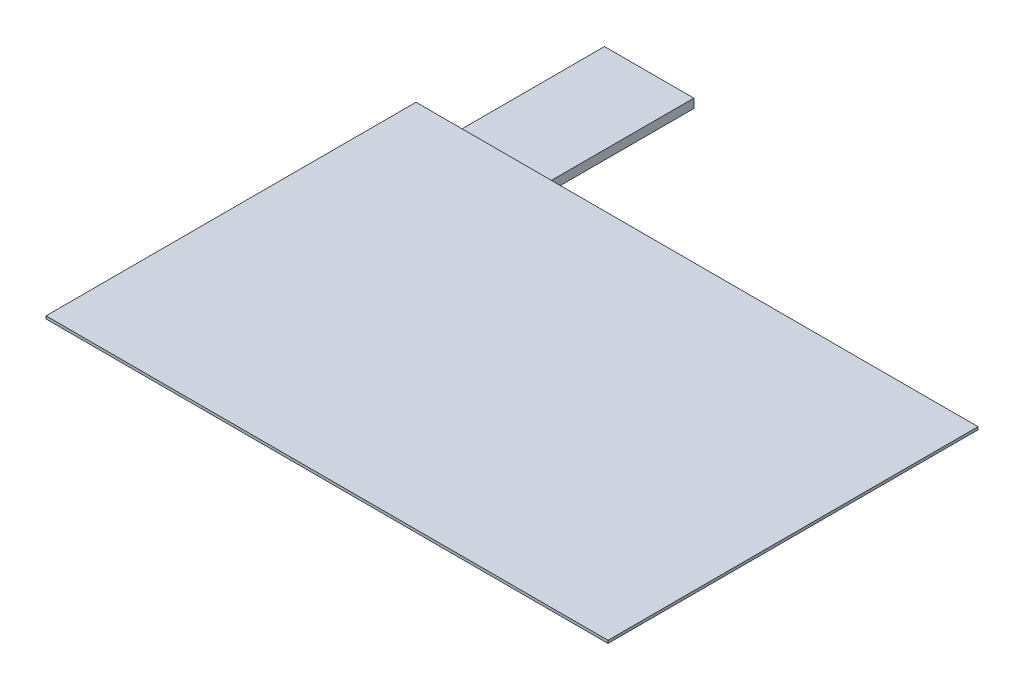
ISO-10303-21;
HEADER;
FILE_DESCRIPTION(('STEP AP214'),'2;1');
FILE_NAME('part.step','',(''),(''),'','','');
FILE_SCHEMA(('AUTOMOTIVE_DESIGN { 1 0 10303 214 1 1 1 1 }'));
ENDSEC;
DATA;
#1=APPLICATION_CONTEXT('core data for automotive mechanical design processes');
#2=APPLICATION_PROTOCOL_DEFINITION('international standard','automotive_design',2000,#1);
#3=PRODUCT_CONTEXT('',#1,'mechanical');
#4=PRODUCT('Part','Part','',(#3));
#5=PRODUCT_RELATED_PRODUCT_CATEGORY('part','',(#4));
#6=PRODUCT_DEFINITION_FORMATION('','',#4);
#7=PRODUCT_DEFINITION_CONTEXT('part definition',#1,'design');
#8=PRODUCT_DEFINITION('design','',#6,#7);
#9=PRODUCT_DEFINITION_SHAPE('','',#8);
#10=(LENGTH_UNIT() NAMED_UNIT(*) SI_UNIT(.MILLI.,.METRE.));
#11=(NAMED_UNIT(*) PLANE_ANGLE_UNIT() SI_UNIT($,.RADIAN.));
#12=(NAMED_UNIT(*) SI_UNIT($,.STERADIAN.) SOLID_ANGLE_UNIT());
#13=UNCERTAINTY_MEASURE_WITH_UNIT(LENGTH_MEASURE(1.E-05),#10,'distance_accuracy_value','');
#14=(GEOMETRIC_REPRESENTATION_CONTEXT(3) GLOBAL_UNCERTAINTY_ASSIGNED_CONTEXT((#13)) GLOBAL_UNIT_ASSIGNED_CONTEXT((#10,
#11,#12)) REPRESENTATION_CONTEXT('',''));
#15=CARTESIAN_POINT('',(0.,0.,0.));
#16=DIRECTION('',(0.,0.,1.));
#17=DIRECTION('',(1.,0.,0.));
#18=AXIS2_PLACEMENT_3D('',#15,#16,#17);
#19=CARTESIAN_POINT('',(-67.46875,91.4422048345292,-68.2625));
#20=DIRECTION('',(1.,0.,0.));
#21=DIRECTION('',(0.,0.,-1.));
#22=AXIS2_PLACEMENT_3D('',#19,#20,#21);
#23=PLANE('',#22);
#24=DIRECTION('',(0.,0.,-1.));
#25=VECTOR('',#24,1.);
#26=CARTESIAN_POINT('',(-67.46875,0.,-68.2625));
#27=LINE('',#26,#25);
#28=CARTESIAN_POINT('',(-67.46875,0.,-68.2625));
#29=VERTEX_POINT('',#28);
#30=CARTESIAN_POINT('',(-67.46875,0.,-150.1775));
#31=VERTEX_POINT('',#30);
#32=EDGE_CURVE('E51',#29,#31,#27,.T.);
#33=ORIENTED_EDGE('',*,*,#32,.F.);
#34=DIRECTION('',(0.,-1.,0.));
#35=VECTOR('',#34,1.);
#36=CARTESIAN_POINT('',(-67.46875,91.4422048345292,-68.2625));
#37=LINE('',#36,#35);
#38=CARTESIAN_POINT('',(-67.46875,-4.0894,-68.2625));
#39=VERTEX_POINT('',#38);
#40=EDGE_CURVE('E79',#29,#39,#37,.T.);
#41=ORIENTED_EDGE('',*,*,#40,.T.);
#42=DIRECTION('',(0.,0.,1.));
#43=VECTOR('',#42,1.);
#44=CARTESIAN_POINT('',(-67.46875,-4.0894,-68.2625));
#45=LINE('',#44,#43);
#46=CARTESIAN_POINT('',(-67.46875,-4.0894,-150.1775));
#47=VERTEX_POINT('',#46);
#48=EDGE_CURVE('E83',#47,#39,#45,.T.);
#49=ORIENTED_EDGE('',*,*,#48,.F.);
#50=DIRECTION('',(0.,-1.,0.));
#51=VECTOR('',#50,1.);
#52=CARTESIAN_POINT('',(-67.46875,91.4422048345292,-150.1775));
#53=LINE('',#52,#51);
#54=EDGE_CURVE('E106',#31,#47,#53,.T.);
#55=ORIENTED_EDGE('',*,*,#54,.F.);
#56=EDGE_LOOP('',(#33,#41,#49,#55));
#57=FACE_BOUND('',#56,.T.);
#58=ADVANCED_FACE('F43',(#57),#23,.T.);
#59=CARTESIAN_POINT('',(-108.10875,91.4422048345292,-150.1775));
#60=DIRECTION('',(0.,0.,-1.));
#61=DIRECTION('',(-1.,0.,0.));
#62=AXIS2_PLACEMENT_3D('',#59,#60,#61);
#63=PLANE('',#62);
#64=DIRECTION('',(-1.,0.,0.));
#65=VECTOR('',#64,1.);
#66=CARTESIAN_POINT('',(-108.10875,0.,-150.1775));
#67=LINE('',#66,#65);
#68=CARTESIAN_POINT('',(-108.10875,0.,-150.1775));
#69=VERTEX_POINT('',#68);
#70=EDGE_CURVE('E57',#31,#69,#67,.T.);
#71=ORIENTED_EDGE('',*,*,#70,.F.);
#72=ORIENTED_EDGE('',*,*,#54,.T.);
#73=DIRECTION('',(1.,0.,0.));
#74=VECTOR('',#73,1.);
#75=CARTESIAN_POINT('',(-108.10875,-4.0894,-150.1775));
#76=LINE('',#75,#74);
#77=CARTESIAN_POINT('',(-108.10875,-4.0894,-150.1775));
#78=VERTEX_POINT('',#77);
#79=EDGE_CURVE('E88',#78,#47,#76,.T.);
#80=ORIENTED_EDGE('',*,*,#79,.F.);
#81=DIRECTION('',(0.,-1.,0.));
#82=VECTOR('',#81,1.);
#83=CARTESIAN_POINT('',(-108.10875,91.4422048345292,-150.1775));
#84=LINE('',#83,#82);
#85=EDGE_CURVE('E109',#69,#78,#84,.T.);
#86=ORIENTED_EDGE('',*,*,#85,.F.);
#87=EDGE_LOOP('',(#71,#72,#80,#86));
#88=FACE_BOUND('',#87,.T.);
#89=ADVANCED_FACE('F115',(#88),#63,.T.);
#90=CARTESIAN_POINT('',(-108.10875,91.4422048345292,-68.2625));
#91=DIRECTION('',(-1.,0.,0.));
#92=DIRECTION('',(0.,0.,1.));
#93=AXIS2_PLACEMENT_3D('',#90,#91,#92);
#94=PLANE('',#93);
#95=DIRECTION('',(0.,0.,1.));
#96=VECTOR('',#95,1.);
#97=CARTESIAN_POINT('',(-108.10875,0.,-68.2625));
#98=LINE('',#97,#96);
#99=CARTESIAN_POINT('',(-108.10875,0.,-68.2625));
#100=VERTEX_POINT('',#99);
#101=EDGE_CURVE('E108',#69,#100,#98,.T.);
#102=ORIENTED_EDGE('',*,*,#101,.F.);
#103=ORIENTED_EDGE('',*,*,#85,.T.);
#104=DIRECTION('',(0.,0.,-1.));
#105=VECTOR('',#104,1.);
#106=CARTESIAN_POINT('',(-108.10875,-4.0894,-68.2625));
#107=LINE('',#106,#105);
#108=CARTESIAN_POINT('',(-108.10875,-4.0894,-68.2625));
#109=VERTEX_POINT('',#108);
#110=EDGE_CURVE('E96',#109,#78,#107,.T.);
#111=ORIENTED_EDGE('',*,*,#110,.F.);
#112=DIRECTION('',(0.,-1.,0.));
#113=VECTOR('',#112,1.);
#114=CARTESIAN_POINT('',(-108.10875,91.4422048345292,-68.2625));
#115=LINE('',#114,#113);
#116=EDGE_CURVE('E87',#100,#109,#115,.T.);
#117=ORIENTED_EDGE('',*,*,#116,.F.);
#118=EDGE_LOOP('',(#102,#103,#111,#117));
#119=FACE_BOUND('',#118,.T.);
#120=ADVANCED_FACE('F113',(#119),#94,.T.);
#121=CARTESIAN_POINT('',(-108.10875,91.4422048345292,-68.2625));
#122=DIRECTION('',(0.,0.,1.));
#123=DIRECTION('',(1.,0.,0.));
#124=AXIS2_PLACEMENT_3D('',#121,#122,#123);
#125=PLANE('',#124);
#126=DIRECTION('',(1.,0.,0.));
#127=VECTOR('',#126,1.);
#128=CARTESIAN_POINT('',(-108.10875,0.,-68.2625));
#129=LINE('',#128,#127);
#130=EDGE_CURVE('E12',#100,#29,#129,.T.);
#131=ORIENTED_EDGE('',*,*,#130,.F.);
#132=ORIENTED_EDGE('',*,*,#116,.T.);
#133=DIRECTION('',(-1.,0.,0.));
#134=VECTOR('',#133,1.);
#135=CARTESIAN_POINT('',(-108.10875,-4.0894,-68.2625));
#136=LINE('',#135,#134);
#137=EDGE_CURVE('E90',#39,#109,#136,.T.);
#138=ORIENTED_EDGE('',*,*,#137,.F.);
#139=ORIENTED_EDGE('',*,*,#40,.F.);
#140=EDGE_LOOP('',(#131,#132,#138,#139));
#141=FACE_BOUND('',#140,.T.);
#142=ADVANCED_FACE('F91',(#141),#125,.T.);
#143=CARTESIAN_POINT('',(0.,-4.0894,0.));
#144=DIRECTION('',(0.,-1.,0.));
#145=DIRECTION('',(0.,0.,-1.));
#146=AXIS2_PLACEMENT_3D('',#143,#144,#145);
#147=PLANE('',#146);
#148=ORIENTED_EDGE('',*,*,#48,.T.);
#149=ORIENTED_EDGE('',*,*,#137,.T.);
#150=ORIENTED_EDGE('',*,*,#110,.T.);
#151=ORIENTED_EDGE('',*,*,#79,.T.);
#152=EDGE_LOOP('',(#148,#149,#150,#151));
#153=FACE_BOUND('',#152,.T.);
#154=ADVANCED_FACE('F98',(#153),#147,.T.);
#155=CARTESIAN_POINT('',(0.,0.,0.));
#156=DIRECTION('',(0.,-1.,0.));
#157=DIRECTION('',(0.,0.,-1.));
#158=AXIS2_PLACEMENT_3D('',#155,#156,#157);
#159=PLANE('',#158);
#160=ORIENTED_EDGE('',*,*,#32,.T.);
#161=ORIENTED_EDGE('',*,*,#70,.T.);
#162=ORIENTED_EDGE('',*,*,#101,.T.);
#163=ORIENTED_EDGE('',*,*,#130,.T.);
#164=EDGE_LOOP('',(#160,#161,#162,#163));
#165=FACE_BOUND('',#164,.T.);
#166=ADVANCED_FACE('F117',(#165),#159,.F.);
#167=CLOSED_SHELL('',(#58,#89,#120,#142,#154,#166));
#168=MANIFOLD_SOLID_BREP('B2',#167);
#169=CARTESIAN_POINT('',(127.79375,1.2446,84.1375));
#170=DIRECTION('',(-1.,0.,0.));
#171=DIRECTION('',(0.,0.,1.));
#172=AXIS2_PLACEMENT_3D('',#169,#170,#171);
#173=PLANE('',#172);
#174=DIRECTION('',(0.,0.,-1.));
#175=VECTOR('',#174,1.);
#176=CARTESIAN_POINT('',(127.79375,0.,84.1375));
#177=LINE('',#176,#175);
#178=CARTESIAN_POINT('',(127.79375,0.,84.1375));
#179=VERTEX_POINT('',#178);
#180=CARTESIAN_POINT('',(127.79375,0.,-84.1375));
#181=VERTEX_POINT('',#180);
#182=EDGE_CURVE('E250',#179,#181,#177,.T.);
#183=ORIENTED_EDGE('',*,*,#182,.T.);
#184=DIRECTION('',(0.,-1.,0.));
#185=VECTOR('',#184,1.);
#186=CARTESIAN_POINT('',(127.79375,1.2446,-84.1375));
#187=LINE('',#186,#185);
#188=CARTESIAN_POINT('',(127.79375,1.2446,-84.1375));
#189=VERTEX_POINT('',#188);
#190=EDGE_CURVE('E41',#189,#181,#187,.T.);
#191=ORIENTED_EDGE('',*,*,#190,.F.);
#192=DIRECTION('',(0.,0.,-1.));
#193=VECTOR('',#192,1.);
#194=CARTESIAN_POINT('',(127.79375,1.2446,84.1375));
#195=LINE('',#194,#193);
#196=CARTESIAN_POINT('',(127.79375,1.2446,84.1375));
#197=VERTEX_POINT('',#196);
#198=EDGE_CURVE('E259',#197,#189,#195,.T.);
#199=ORIENTED_EDGE('',*,*,#198,.F.);
#200=DIRECTION('',(0.,-1.,0.));
#201=VECTOR('',#200,1.);
#202=CARTESIAN_POINT('',(127.79375,1.2446,84.1375));
#203=LINE('',#202,#201);
#204=EDGE_CURVE('E268',#197,#179,#203,.T.);
#205=ORIENTED_EDGE('',*,*,#204,.T.);
#206=EDGE_LOOP('',(#183,#191,#199,#205));
#207=FACE_BOUND('',#206,.T.);
#208=ADVANCED_FACE('F166',(#207),#173,.F.);
#209=CARTESIAN_POINT('',(-127.79375,1.2446,-84.1375));
#210=DIRECTION('',(0.,0.,1.));
#211=DIRECTION('',(1.,0.,0.));
#212=AXIS2_PLACEMENT_3D('',#209,#210,#211);
#213=PLANE('',#212);
#214=DIRECTION('',(-1.,0.,0.));
#215=VECTOR('',#214,1.);
#216=CARTESIAN_POINT('',(-127.79375,0.,-84.1375));
#217=LINE('',#216,#215);
#218=CARTESIAN_POINT('',(-127.79375,0.,-84.1375));
#219=VERTEX_POINT('',#218);
#220=EDGE_CURVE('E253',#181,#219,#217,.T.);
#221=ORIENTED_EDGE('',*,*,#220,.T.);
#222=DIRECTION('',(0.,-1.,0.));
#223=VECTOR('',#222,1.);
#224=CARTESIAN_POINT('',(-127.79375,1.2446,-84.1375));
#225=LINE('',#224,#223);
#226=CARTESIAN_POINT('',(-127.79375,1.2446,-84.1375));
#227=VERTEX_POINT('',#226);
#228=EDGE_CURVE('E173',#227,#219,#225,.T.);
#229=ORIENTED_EDGE('',*,*,#228,.F.);
#230=DIRECTION('',(-1.,0.,0.));
#231=VECTOR('',#230,1.);
#232=CARTESIAN_POINT('',(-127.79375,1.2446,-84.1375));
#233=LINE('',#232,#231);
#234=EDGE_CURVE('E262',#189,#227,#233,.T.);
#235=ORIENTED_EDGE('',*,*,#234,.F.);
#236=ORIENTED_EDGE('',*,*,#190,.T.);
#237=EDGE_LOOP('',(#221,#229,#235,#236));
#238=FACE_BOUND('',#237,.T.);
#239=ADVANCED_FACE('F299',(#238),#213,.F.);
#240=CARTESIAN_POINT('',(-127.79375,1.2446,84.1375));
#241=DIRECTION('',(1.,0.,0.));
#242=DIRECTION('',(0.,0.,-1.));
#243=AXIS2_PLACEMENT_3D('',#240,#241,#242);
#244=PLANE('',#243);
#245=DIRECTION('',(0.,0.,1.));
#246=VECTOR('',#245,1.);
#247=CARTESIAN_POINT('',(-127.79375,0.,84.1375));
#248=LINE('',#247,#246);
#249=CARTESIAN_POINT('',(-127.79375,0.,84.1375));
#250=VERTEX_POINT('',#249);
#251=EDGE_CURVE('E271',#219,#250,#248,.T.);
#252=ORIENTED_EDGE('',*,*,#251,.T.);
#253=DIRECTION('',(0.,-1.,0.));
#254=VECTOR('',#253,1.);
#255=CARTESIAN_POINT('',(-127.79375,1.2446,84.1375));
#256=LINE('',#255,#254);
#257=CARTESIAN_POINT('',(-127.79375,1.2446,84.1375));
#258=VERTEX_POINT('',#257);
#259=EDGE_CURVE('E276',#258,#250,#256,.T.);
#260=ORIENTED_EDGE('',*,*,#259,.F.);
#261=DIRECTION('',(0.,0.,1.));
#262=VECTOR('',#261,1.);
#263=CARTESIAN_POINT('',(-127.79375,1.2446,84.1375));
#264=LINE('',#263,#262);
#265=EDGE_CURVE('E265',#227,#258,#264,.T.);
#266=ORIENTED_EDGE('',*,*,#265,.F.);
#267=ORIENTED_EDGE('',*,*,#228,.T.);
#268=EDGE_LOOP('',(#252,#260,#266,#267));
#269=FACE_BOUND('',#268,.T.);
#270=ADVANCED_FACE('F283',(#269),#244,.F.);
#271=CARTESIAN_POINT('',(-127.79375,1.2446,84.1375));
#272=DIRECTION('',(0.,0.,-1.));
#273=DIRECTION('',(-1.,0.,0.));
#274=AXIS2_PLACEMENT_3D('',#271,#272,#273);
#275=PLANE('',#274);
#276=DIRECTION('',(1.,0.,0.));
#277=VECTOR('',#276,1.);
#278=CARTESIAN_POINT('',(-127.79375,0.,84.1375));
#279=LINE('',#278,#277);
#280=EDGE_CURVE('E263',#250,#179,#279,.T.);
#281=ORIENTED_EDGE('',*,*,#280,.T.);
#282=ORIENTED_EDGE('',*,*,#204,.F.);
#283=DIRECTION('',(1.,0.,0.));
#284=VECTOR('',#283,1.);
#285=CARTESIAN_POINT('',(-127.79375,1.2446,84.1375));
#286=LINE('',#285,#284);
#287=EDGE_CURVE('E267',#258,#197,#286,.T.);
#288=ORIENTED_EDGE('',*,*,#287,.F.);
#289=ORIENTED_EDGE('',*,*,#259,.T.);
#290=EDGE_LOOP('',(#281,#282,#288,#289));
#291=FACE_BOUND('',#290,.T.);
#292=ADVANCED_FACE('F292',(#291),#275,.F.);
#293=CARTESIAN_POINT('',(0.,1.2446,0.));
#294=DIRECTION('',(0.,-1.,0.));
#295=DIRECTION('',(0.,0.,-1.));
#296=AXIS2_PLACEMENT_3D('',#293,#294,#295);
#297=PLANE('',#296);
#298=ORIENTED_EDGE('',*,*,#198,.T.);
#299=ORIENTED_EDGE('',*,*,#234,.T.);
#300=ORIENTED_EDGE('',*,*,#265,.T.);
#301=ORIENTED_EDGE('',*,*,#287,.T.);
#302=EDGE_LOOP('',(#298,#299,#300,#301));
#303=FACE_BOUND('',#302,.T.);
#304=ADVANCED_FACE('F298',(#303),#297,.F.);
#305=CARTESIAN_POINT('',(0.,0.,0.));
#306=DIRECTION('',(0.,-1.,0.));
#307=DIRECTION('',(0.,0.,-1.));
#308=AXIS2_PLACEMENT_3D('',#305,#306,#307);
#309=PLANE('',#308);
#310=DIRECTION('',(0.,0.,1.));
#311=VECTOR('',#310,1.);
#312=CARTESIAN_POINT('',(114.3,0.,-68.2625));
#313=LINE('',#312,#311);
#314=CARTESIAN_POINT('',(114.3,0.,-68.2625));
#315=VERTEX_POINT('',#314);
#316=CARTESIAN_POINT('',(114.3,0.,68.2625));
#317=VERTEX_POINT('',#316);
#318=EDGE_CURVE('E180',#315,#317,#313,.T.);
#319=ORIENTED_EDGE('',*,*,#318,.F.);
#320=DIRECTION('',(1.,0.,0.));
#321=VECTOR('',#320,1.);
#322=CARTESIAN_POINT('',(-114.3,0.,-68.2625));
#323=LINE('',#322,#321);
#324=CARTESIAN_POINT('',(-114.3,0.,-68.2625));
#325=VERTEX_POINT('',#324);
#326=EDGE_CURVE('E184',#325,#315,#323,.T.);
#327=ORIENTED_EDGE('',*,*,#326,.F.);
#328=DIRECTION('',(0.,0.,-1.));
#329=VECTOR('',#328,1.);
#330=CARTESIAN_POINT('',(-114.3,0.,-68.2625));
#331=LINE('',#330,#329);
#332=CARTESIAN_POINT('',(-114.3,0.,68.2625));
#333=VERTEX_POINT('',#332);
#334=EDGE_CURVE('E393',#333,#325,#331,.T.);
#335=ORIENTED_EDGE('',*,*,#334,.F.);
#336=DIRECTION('',(-1.,0.,0.));
#337=VECTOR('',#336,1.);
#338=CARTESIAN_POINT('',(-114.3,0.,68.2625));
#339=LINE('',#338,#337);
#340=EDGE_CURVE('E399',#317,#333,#339,.T.);
#341=ORIENTED_EDGE('',*,*,#340,.F.);
#342=EDGE_LOOP('',(#319,#327,#335,#341));
#343=FACE_BOUND('',#342,.T.);
#344=ORIENTED_EDGE('',*,*,#182,.F.);
#345=ORIENTED_EDGE('',*,*,#280,.F.);
#346=ORIENTED_EDGE('',*,*,#251,.F.);
#347=ORIENTED_EDGE('',*,*,#220,.F.);
#348=EDGE_LOOP('',(#344,#345,#346,#347));
#349=FACE_BOUND('',#348,.T.);
#350=ADVANCED_FACE('F289',(#343,#349),#309,.T.);
#351=CARTESIAN_POINT('',(114.3,-4.0894,-68.2625));
#352=DIRECTION('',(-1.,0.,0.));
#353=DIRECTION('',(0.,0.,1.));
#354=AXIS2_PLACEMENT_3D('',#351,#352,#353);
#355=PLANE('',#354);
#356=ORIENTED_EDGE('',*,*,#318,.T.);
#357=DIRECTION('',(0.,1.,0.));
#358=VECTOR('',#357,1.);
#359=CARTESIAN_POINT('',(114.3,-4.0894,68.2625));
#360=LINE('',#359,#358);
#361=CARTESIAN_POINT('',(114.3,-4.0894,68.2625));
#362=VERTEX_POINT('',#361);
#363=EDGE_CURVE('E233',#362,#317,#360,.T.);
#364=ORIENTED_EDGE('',*,*,#363,.F.);
#365=DIRECTION('',(0.,0.,1.));
#366=VECTOR('',#365,1.);
#367=CARTESIAN_POINT('',(114.3,-4.0894,-68.2625));
#368=LINE('',#367,#366);
#369=CARTESIAN_POINT('',(114.3,-4.0894,-68.2625));
#370=VERTEX_POINT('',#369);
#371=EDGE_CURVE('E239',#370,#362,#368,.T.);
#372=ORIENTED_EDGE('',*,*,#371,.F.);
#373=DIRECTION('',(0.,1.,0.));
#374=VECTOR('',#373,1.);
#375=CARTESIAN_POINT('',(114.3,-4.0894,-68.2625));
#376=LINE('',#375,#374);
#377=EDGE_CURVE('E391',#370,#315,#376,.T.);
#378=ORIENTED_EDGE('',*,*,#377,.T.);
#379=EDGE_LOOP('',(#356,#364,#372,#378));
#380=FACE_BOUND('',#379,.T.);
#381=ADVANCED_FACE('F249',(#380),#355,.F.);
#382=CARTESIAN_POINT('',(-114.3,-4.0894,68.2625));
#383=DIRECTION('',(0.,0.,-1.));
#384=DIRECTION('',(-1.,0.,0.));
#385=AXIS2_PLACEMENT_3D('',#382,#383,#384);
#386=PLANE('',#385);
#387=ORIENTED_EDGE('',*,*,#340,.T.);
#388=DIRECTION('',(0.,1.,0.));
#389=VECTOR('',#388,1.);
#390=CARTESIAN_POINT('',(-114.3,-4.0894,68.2625));
#391=LINE('',#390,#389);
#392=CARTESIAN_POINT('',(-114.3,-4.0894,68.2625));
#393=VERTEX_POINT('',#392);
#394=EDGE_CURVE('E235',#393,#333,#391,.T.);
#395=ORIENTED_EDGE('',*,*,#394,.F.);
#396=DIRECTION('',(-1.,0.,0.));
#397=VECTOR('',#396,1.);
#398=CARTESIAN_POINT('',(-114.3,-4.0894,68.2625));
#399=LINE('',#398,#397);
#400=EDGE_CURVE('E228',#362,#393,#399,.T.);
#401=ORIENTED_EDGE('',*,*,#400,.F.);
#402=ORIENTED_EDGE('',*,*,#363,.T.);
#403=EDGE_LOOP('',(#387,#395,#401,#402));
#404=FACE_BOUND('',#403,.T.);
#405=ADVANCED_FACE('F231',(#404),#386,.F.);
#406=CARTESIAN_POINT('',(-114.3,-4.0894,-68.2625));
#407=DIRECTION('',(1.,0.,0.));
#408=DIRECTION('',(0.,0.,-1.));
#409=AXIS2_PLACEMENT_3D('',#406,#407,#408);
#410=PLANE('',#409);
#411=ORIENTED_EDGE('',*,*,#334,.T.);
#412=DIRECTION('',(0.,1.,0.));
#413=VECTOR('',#412,1.);
#414=CARTESIAN_POINT('',(-114.3,-4.0894,-68.2625));
#415=LINE('',#414,#413);
#416=CARTESIAN_POINT('',(-114.3,-4.0894,-68.2625));
#417=VERTEX_POINT('',#416);
#418=EDGE_CURVE('E255',#417,#325,#415,.T.);
#419=ORIENTED_EDGE('',*,*,#418,.F.);
#420=DIRECTION('',(0.,0.,-1.));
#421=VECTOR('',#420,1.);
#422=CARTESIAN_POINT('',(-114.3,-4.0894,-68.2625));
#423=LINE('',#422,#421);
#424=EDGE_CURVE('E238',#393,#417,#423,.T.);
#425=ORIENTED_EDGE('',*,*,#424,.F.);
#426=ORIENTED_EDGE('',*,*,#394,.T.);
#427=EDGE_LOOP('',(#411,#419,#425,#426));
#428=FACE_BOUND('',#427,.T.);
#429=ADVANCED_FACE('F317',(#428),#410,.F.);
#430=CARTESIAN_POINT('',(-114.3,-4.0894,-68.2625));
#431=DIRECTION('',(0.,0.,1.));
#432=DIRECTION('',(1.,0.,0.));
#433=AXIS2_PLACEMENT_3D('',#430,#431,#432);
#434=PLANE('',#433);
#435=ORIENTED_EDGE('',*,*,#326,.T.);
#436=ORIENTED_EDGE('',*,*,#377,.F.);
#437=DIRECTION('',(1.,0.,0.));
#438=VECTOR('',#437,1.);
#439=CARTESIAN_POINT('',(-114.3,-4.0894,-68.2625));
#440=LINE('',#439,#438);
#441=EDGE_CURVE('E244',#417,#370,#440,.T.);
#442=ORIENTED_EDGE('',*,*,#441,.F.);
#443=ORIENTED_EDGE('',*,*,#418,.T.);
#444=EDGE_LOOP('',(#435,#436,#442,#443));
#445=FACE_BOUND('',#444,.T.);
#446=ADVANCED_FACE('F320',(#445),#434,.F.);
#447=CARTESIAN_POINT('',(0.,-4.0894,0.));
#448=DIRECTION('',(0.,1.,0.));
#449=DIRECTION('',(0.,0.,1.));
#450=AXIS2_PLACEMENT_3D('',#447,#448,#449);
#451=PLANE('',#450);
#452=ORIENTED_EDGE('',*,*,#371,.T.);
#453=ORIENTED_EDGE('',*,*,#400,.T.);
#454=ORIENTED_EDGE('',*,*,#424,.T.);
#455=ORIENTED_EDGE('',*,*,#441,.T.);
#456=EDGE_LOOP('',(#452,#453,#454,#455));
#457=FACE_BOUND('',#456,.T.);
#458=ADVANCED_FACE('F242',(#457),#451,.F.);
#459=CLOSED_SHELL('',(#208,#239,#270,#292,#304,#350,#381,#405,#429,#446,#458));
#460=MANIFOLD_SOLID_BREP('B6',#459);
#461=ADVANCED_BREP_SHAPE_REPRESENTATION('',(#18,#168,#460),#14);
#462=SHAPE_DEFINITION_REPRESENTATION(#9,#461);
ENDSEC;
END-ISO-10303-21;
